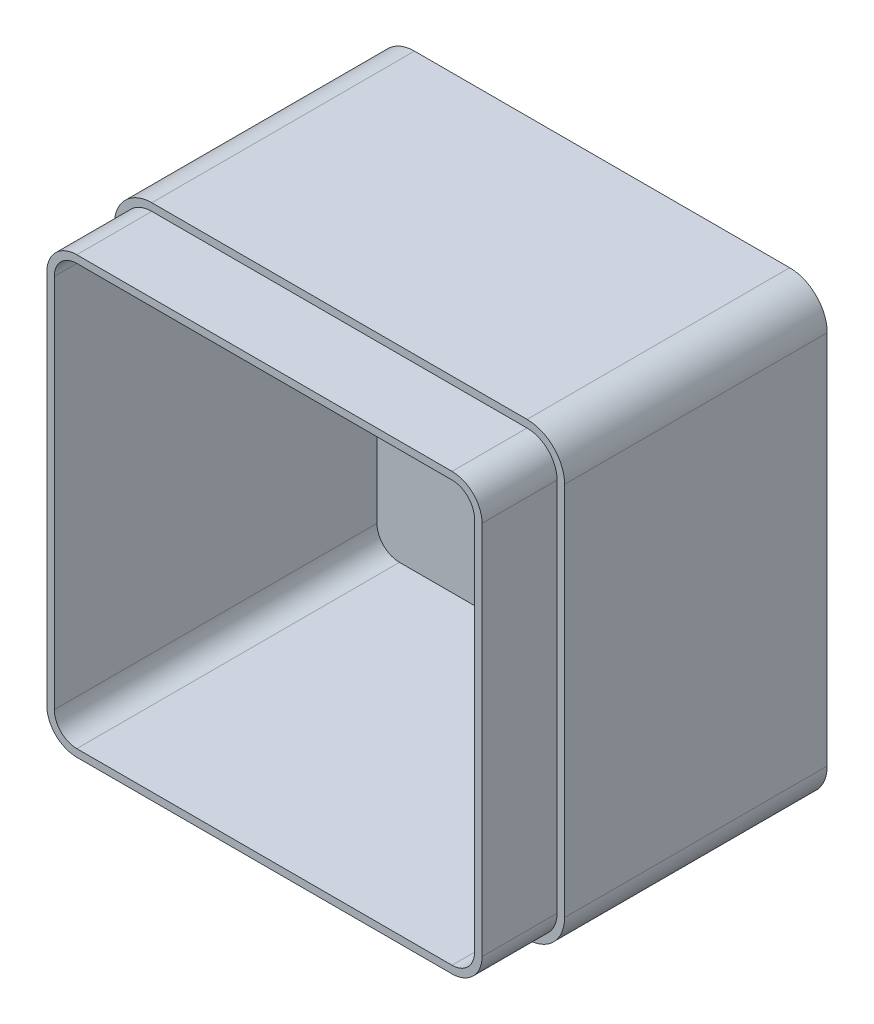
ISO-10303-21;
HEADER;
FILE_DESCRIPTION(('STEP AP214'),'2;1');
FILE_NAME('part.step','',(''),(''),'','','');
FILE_SCHEMA(('AUTOMOTIVE_DESIGN { 1 0 10303 214 1 1 1 1 }'));
ENDSEC;
DATA;
#1=APPLICATION_CONTEXT('core data for automotive mechanical design processes');
#2=APPLICATION_PROTOCOL_DEFINITION('international standard','automotive_design',2000,#1);
#3=PRODUCT_CONTEXT('',#1,'mechanical');
#4=PRODUCT('Part','Part','',(#3));
#5=PRODUCT_RELATED_PRODUCT_CATEGORY('part','',(#4));
#6=PRODUCT_DEFINITION_FORMATION('','',#4);
#7=PRODUCT_DEFINITION_CONTEXT('part definition',#1,'design');
#8=PRODUCT_DEFINITION('design','',#6,#7);
#9=PRODUCT_DEFINITION_SHAPE('','',#8);
#10=(LENGTH_UNIT() NAMED_UNIT(*) SI_UNIT(.MILLI.,.METRE.));
#11=(NAMED_UNIT(*) PLANE_ANGLE_UNIT() SI_UNIT($,.RADIAN.));
#12=(NAMED_UNIT(*) SI_UNIT($,.STERADIAN.) SOLID_ANGLE_UNIT());
#13=UNCERTAINTY_MEASURE_WITH_UNIT(LENGTH_MEASURE(1.E-05),#10,'distance_accuracy_value','');
#14=(GEOMETRIC_REPRESENTATION_CONTEXT(3) GLOBAL_UNCERTAINTY_ASSIGNED_CONTEXT((#13)) GLOBAL_UNIT_ASSIGNED_CONTEXT((#10,
#11,#12)) REPRESENTATION_CONTEXT('',''));
#15=CARTESIAN_POINT('',(0.,0.,0.));
#16=DIRECTION('',(0.,0.,1.));
#17=DIRECTION('',(1.,0.,0.));
#18=AXIS2_PLACEMENT_3D('',#15,#16,#17);
#19=CARTESIAN_POINT('',(0.,0.,90.));
#20=DIRECTION('',(0.,0.,1.));
#21=DIRECTION('',(1.,0.,0.));
#22=AXIS2_PLACEMENT_3D('',#19,#20,#21);
#23=PLANE('',#22);
#24=DIRECTION('',(1.,0.,0.));
#25=VECTOR('',#24,1.);
#26=CARTESIAN_POINT('',(-60.,-56.,90.));
#27=LINE('',#26,#25);
#28=CARTESIAN_POINT('',(-50.,-56.,90.));
#29=VERTEX_POINT('',#28);
#30=CARTESIAN_POINT('',(50.,-56.,90.));
#31=VERTEX_POINT('',#30);
#32=EDGE_CURVE('E291',#29,#31,#27,.T.);
#33=ORIENTED_EDGE('',*,*,#32,.F.);
#34=CARTESIAN_POINT('',(-50.,-50.,90.));
#35=DIRECTION('',(0.,0.,1.));
#36=DIRECTION('',(1.,0.,0.));
#37=AXIS2_PLACEMENT_3D('',#34,#35,#36);
#38=CIRCLE('',#37,6.);
#39=CARTESIAN_POINT('',(-56.,-50.,90.));
#40=VERTEX_POINT('',#39);
#41=EDGE_CURVE('E332',#40,#29,#38,.T.);
#42=ORIENTED_EDGE('',*,*,#41,.F.);
#43=DIRECTION('',(0.,-1.,0.));
#44=VECTOR('',#43,1.);
#45=CARTESIAN_POINT('',(-56.,60.,90.));
#46=LINE('',#45,#44);
#47=CARTESIAN_POINT('',(-56.,50.,90.));
#48=VERTEX_POINT('',#47);
#49=EDGE_CURVE('E335',#48,#40,#46,.T.);
#50=ORIENTED_EDGE('',*,*,#49,.F.);
#51=CARTESIAN_POINT('',(-50.,50.,90.));
#52=DIRECTION('',(0.,0.,1.));
#53=DIRECTION('',(1.,0.,0.));
#54=AXIS2_PLACEMENT_3D('',#51,#52,#53);
#55=CIRCLE('',#54,6.);
#56=CARTESIAN_POINT('',(-50.,56.,90.));
#57=VERTEX_POINT('',#56);
#58=EDGE_CURVE('E326',#57,#48,#55,.T.);
#59=ORIENTED_EDGE('',*,*,#58,.F.);
#60=DIRECTION('',(-1.,0.,0.));
#61=VECTOR('',#60,1.);
#62=CARTESIAN_POINT('',(-60.,56.,90.));
#63=LINE('',#62,#61);
#64=CARTESIAN_POINT('',(50.,56.,90.));
#65=VERTEX_POINT('',#64);
#66=EDGE_CURVE('E329',#65,#57,#63,.T.);
#67=ORIENTED_EDGE('',*,*,#66,.F.);
#68=CARTESIAN_POINT('',(50.,50.,90.));
#69=DIRECTION('',(0.,0.,1.));
#70=DIRECTION('',(1.,0.,0.));
#71=AXIS2_PLACEMENT_3D('',#68,#69,#70);
#72=CIRCLE('',#71,6.);
#73=CARTESIAN_POINT('',(56.,50.,90.));
#74=VERTEX_POINT('',#73);
#75=EDGE_CURVE('E330',#74,#65,#72,.T.);
#76=ORIENTED_EDGE('',*,*,#75,.F.);
#77=DIRECTION('',(0.,1.,0.));
#78=VECTOR('',#77,1.);
#79=CARTESIAN_POINT('',(56.,60.,90.));
#80=LINE('',#79,#78);
#81=CARTESIAN_POINT('',(56.,-50.,90.));
#82=VERTEX_POINT('',#81);
#83=EDGE_CURVE('E299',#82,#74,#80,.T.);
#84=ORIENTED_EDGE('',*,*,#83,.F.);
#85=CARTESIAN_POINT('',(50.,-50.,90.));
#86=DIRECTION('',(0.,0.,1.));
#87=DIRECTION('',(1.,0.,0.));
#88=AXIS2_PLACEMENT_3D('',#85,#86,#87);
#89=CIRCLE('',#88,6.);
#90=EDGE_CURVE('E319',#31,#82,#89,.T.);
#91=ORIENTED_EDGE('',*,*,#90,.F.);
#92=EDGE_LOOP('',(#33,#42,#50,#59,#67,#76,#84,#91));
#93=FACE_BOUND('',#92,.T.);
#94=DIRECTION('',(0.,-1.,0.));
#95=VECTOR('',#94,1.);
#96=CARTESIAN_POINT('',(-58.,50.,90.));
#97=LINE('',#96,#95);
#98=CARTESIAN_POINT('',(-58.,50.,90.));
#99=VERTEX_POINT('',#98);
#100=CARTESIAN_POINT('',(-58.,-50.,90.));
#101=VERTEX_POINT('',#100);
#102=EDGE_CURVE('E219',#99,#101,#97,.T.);
#103=ORIENTED_EDGE('',*,*,#102,.T.);
#104=CARTESIAN_POINT('',(-50.,-50.,90.));
#105=DIRECTION('',(0.,0.,1.));
#106=DIRECTION('',(1.,0.,0.));
#107=AXIS2_PLACEMENT_3D('',#104,#105,#106);
#108=CIRCLE('',#107,8.);
#109=CARTESIAN_POINT('',(-50.,-58.,90.));
#110=VERTEX_POINT('',#109);
#111=EDGE_CURVE('E239',#101,#110,#108,.T.);
#112=ORIENTED_EDGE('',*,*,#111,.T.);
#113=DIRECTION('',(1.,0.,0.));
#114=VECTOR('',#113,1.);
#115=CARTESIAN_POINT('',(-50.,-58.,90.));
#116=LINE('',#115,#114);
#117=CARTESIAN_POINT('',(50.,-58.,90.));
#118=VERTEX_POINT('',#117);
#119=EDGE_CURVE('E199',#110,#118,#116,.T.);
#120=ORIENTED_EDGE('',*,*,#119,.T.);
#121=CARTESIAN_POINT('',(50.,-50.,90.));
#122=DIRECTION('',(0.,0.,1.));
#123=DIRECTION('',(1.,0.,0.));
#124=AXIS2_PLACEMENT_3D('',#121,#122,#123);
#125=CIRCLE('',#124,8.);
#126=CARTESIAN_POINT('',(58.,-50.,90.));
#127=VERTEX_POINT('',#126);
#128=EDGE_CURVE('E48',#118,#127,#125,.T.);
#129=ORIENTED_EDGE('',*,*,#128,.T.);
#130=DIRECTION('',(0.,1.,0.));
#131=VECTOR('',#130,1.);
#132=CARTESIAN_POINT('',(58.,-50.,90.));
#133=LINE('',#132,#131);
#134=CARTESIAN_POINT('',(58.,50.,90.));
#135=VERTEX_POINT('',#134);
#136=EDGE_CURVE('E243',#127,#135,#133,.T.);
#137=ORIENTED_EDGE('',*,*,#136,.T.);
#138=CARTESIAN_POINT('',(50.,50.,90.));
#139=DIRECTION('',(0.,0.,1.));
#140=DIRECTION('',(1.,0.,0.));
#141=AXIS2_PLACEMENT_3D('',#138,#139,#140);
#142=CIRCLE('',#141,8.);
#143=CARTESIAN_POINT('',(50.,58.,90.));
#144=VERTEX_POINT('',#143);
#145=EDGE_CURVE('E246',#135,#144,#142,.T.);
#146=ORIENTED_EDGE('',*,*,#145,.T.);
#147=DIRECTION('',(-1.,0.,0.));
#148=VECTOR('',#147,1.);
#149=CARTESIAN_POINT('',(50.,58.,90.));
#150=LINE('',#149,#148);
#151=CARTESIAN_POINT('',(-50.,58.,90.));
#152=VERTEX_POINT('',#151);
#153=EDGE_CURVE('E249',#144,#152,#150,.T.);
#154=ORIENTED_EDGE('',*,*,#153,.T.);
#155=CARTESIAN_POINT('',(-50.,50.,90.));
#156=DIRECTION('',(0.,0.,1.));
#157=DIRECTION('',(1.,0.,0.));
#158=AXIS2_PLACEMENT_3D('',#155,#156,#157);
#159=CIRCLE('',#158,7.99999999999999);
#160=EDGE_CURVE('E222',#152,#99,#159,.T.);
#161=ORIENTED_EDGE('',*,*,#160,.T.);
#162=EDGE_LOOP('',(#103,#112,#120,#129,#137,#146,#154,#161));
#163=FACE_BOUND('',#162,.T.);
#164=ADVANCED_FACE('F33',(#93,#163),#23,.T.);
#165=CARTESIAN_POINT('',(56.,60.,90.));
#166=DIRECTION('',(-1.,0.,0.));
#167=DIRECTION('',(0.,-1.,0.));
#168=AXIS2_PLACEMENT_3D('',#165,#166,#167);
#169=PLANE('',#168);
#170=ORIENTED_EDGE('',*,*,#83,.T.);
#171=DIRECTION('',(0.,0.,1.));
#172=VECTOR('',#171,1.);
#173=CARTESIAN_POINT('',(56.,50.,90.));
#174=LINE('',#173,#172);
#175=CARTESIAN_POINT('',(56.,50.,4.));
#176=VERTEX_POINT('',#175);
#177=EDGE_CURVE('E286',#176,#74,#174,.T.);
#178=ORIENTED_EDGE('',*,*,#177,.F.);
#179=DIRECTION('',(0.,1.,0.));
#180=VECTOR('',#179,1.);
#181=CARTESIAN_POINT('',(56.,60.,4.));
#182=LINE('',#181,#180);
#183=CARTESIAN_POINT('',(56.,-50.,4.));
#184=VERTEX_POINT('',#183);
#185=EDGE_CURVE('E281',#184,#176,#182,.T.);
#186=ORIENTED_EDGE('',*,*,#185,.F.);
#187=DIRECTION('',(0.,0.,1.));
#188=VECTOR('',#187,1.);
#189=CARTESIAN_POINT('',(56.,-50.,90.));
#190=LINE('',#189,#188);
#191=EDGE_CURVE('E282',#82,#184,#190,.F.);
#192=ORIENTED_EDGE('',*,*,#191,.F.);
#193=EDGE_LOOP('',(#170,#178,#186,#192));
#194=FACE_BOUND('',#193,.T.);
#195=ADVANCED_FACE('F428',(#194),#169,.T.);
#196=CARTESIAN_POINT('',(-60.,56.,90.));
#197=DIRECTION('',(0.,-1.,0.));
#198=DIRECTION('',(0.,0.,-1.));
#199=AXIS2_PLACEMENT_3D('',#196,#197,#198);
#200=PLANE('',#199);
#201=ORIENTED_EDGE('',*,*,#66,.T.);
#202=DIRECTION('',(0.,0.,-1.));
#203=VECTOR('',#202,1.);
#204=CARTESIAN_POINT('',(-50.,56.,90.));
#205=LINE('',#204,#203);
#206=CARTESIAN_POINT('',(-50.,56.,4.));
#207=VERTEX_POINT('',#206);
#208=EDGE_CURVE('E313',#207,#57,#205,.F.);
#209=ORIENTED_EDGE('',*,*,#208,.F.);
#210=DIRECTION('',(-1.,0.,0.));
#211=VECTOR('',#210,1.);
#212=CARTESIAN_POINT('',(-60.,56.,4.));
#213=LINE('',#212,#211);
#214=CARTESIAN_POINT('',(50.,56.,4.));
#215=VERTEX_POINT('',#214);
#216=EDGE_CURVE('E289',#215,#207,#213,.T.);
#217=ORIENTED_EDGE('',*,*,#216,.F.);
#218=DIRECTION('',(0.,0.,-1.));
#219=VECTOR('',#218,1.);
#220=CARTESIAN_POINT('',(50.,56.,90.));
#221=LINE('',#220,#219);
#222=EDGE_CURVE('E309',#65,#215,#221,.T.);
#223=ORIENTED_EDGE('',*,*,#222,.F.);
#224=EDGE_LOOP('',(#201,#209,#217,#223));
#225=FACE_BOUND('',#224,.T.);
#226=ADVANCED_FACE('F434',(#225),#200,.T.);
#227=CARTESIAN_POINT('',(-56.,60.,90.));
#228=DIRECTION('',(1.,0.,0.));
#229=DIRECTION('',(0.,1.,0.));
#230=AXIS2_PLACEMENT_3D('',#227,#228,#229);
#231=PLANE('',#230);
#232=DIRECTION('',(0.,-1.,0.));
#233=VECTOR('',#232,1.);
#234=CARTESIAN_POINT('',(-56.,60.,4.));
#235=LINE('',#234,#233);
#236=CARTESIAN_POINT('',(-56.,50.,4.));
#237=VERTEX_POINT('',#236);
#238=CARTESIAN_POINT('',(-56.,-50.,4.));
#239=VERTEX_POINT('',#238);
#240=EDGE_CURVE('E300',#237,#239,#235,.T.);
#241=ORIENTED_EDGE('',*,*,#240,.F.);
#242=DIRECTION('',(0.,0.,1.));
#243=VECTOR('',#242,1.);
#244=CARTESIAN_POINT('',(-56.,50.,90.));
#245=LINE('',#244,#243);
#246=EDGE_CURVE('E316',#48,#237,#245,.F.);
#247=ORIENTED_EDGE('',*,*,#246,.F.);
#248=ORIENTED_EDGE('',*,*,#49,.T.);
#249=DIRECTION('',(0.,0.,1.));
#250=VECTOR('',#249,1.);
#251=CARTESIAN_POINT('',(-56.,-50.,90.));
#252=LINE('',#251,#250);
#253=EDGE_CURVE('E315',#239,#40,#252,.T.);
#254=ORIENTED_EDGE('',*,*,#253,.F.);
#255=EDGE_LOOP('',(#241,#247,#248,#254));
#256=FACE_BOUND('',#255,.T.);
#257=ADVANCED_FACE('F463',(#256),#231,.T.);
#258=CARTESIAN_POINT('',(-60.,-56.,90.));
#259=DIRECTION('',(0.,1.,0.));
#260=DIRECTION('',(0.,0.,1.));
#261=AXIS2_PLACEMENT_3D('',#258,#259,#260);
#262=PLANE('',#261);
#263=DIRECTION('',(1.,0.,0.));
#264=VECTOR('',#263,1.);
#265=CARTESIAN_POINT('',(-60.,-56.,4.));
#266=LINE('',#265,#264);
#267=CARTESIAN_POINT('',(-50.,-56.,4.));
#268=VERTEX_POINT('',#267);
#269=CARTESIAN_POINT('',(50.,-56.,4.));
#270=VERTEX_POINT('',#269);
#271=EDGE_CURVE('E296',#268,#270,#266,.T.);
#272=ORIENTED_EDGE('',*,*,#271,.F.);
#273=DIRECTION('',(0.,0.,1.));
#274=VECTOR('',#273,1.);
#275=CARTESIAN_POINT('',(-50.,-56.,90.));
#276=LINE('',#275,#274);
#277=EDGE_CURVE('E294',#29,#268,#276,.F.);
#278=ORIENTED_EDGE('',*,*,#277,.F.);
#279=ORIENTED_EDGE('',*,*,#32,.T.);
#280=DIRECTION('',(0.,0.,1.));
#281=VECTOR('',#280,1.);
#282=CARTESIAN_POINT('',(50.,-56.,90.));
#283=LINE('',#282,#281);
#284=EDGE_CURVE('E324',#270,#31,#283,.T.);
#285=ORIENTED_EDGE('',*,*,#284,.F.);
#286=EDGE_LOOP('',(#272,#278,#279,#285));
#287=FACE_BOUND('',#286,.T.);
#288=ADVANCED_FACE('F459',(#287),#262,.T.);
#289=CARTESIAN_POINT('',(0.,0.,4.));
#290=DIRECTION('',(0.,0.,1.));
#291=DIRECTION('',(1.,0.,0.));
#292=AXIS2_PLACEMENT_3D('',#289,#290,#291);
#293=PLANE('',#292);
#294=ORIENTED_EDGE('',*,*,#185,.T.);
#295=CARTESIAN_POINT('',(50.,50.,4.));
#296=DIRECTION('',(0.,0.,1.));
#297=DIRECTION('',(1.,0.,0.));
#298=AXIS2_PLACEMENT_3D('',#295,#296,#297);
#299=CIRCLE('',#298,6.);
#300=EDGE_CURVE('E302',#215,#176,#299,.F.);
#301=ORIENTED_EDGE('',*,*,#300,.F.);
#302=ORIENTED_EDGE('',*,*,#216,.T.);
#303=CARTESIAN_POINT('',(-50.,50.,4.));
#304=DIRECTION('',(0.,0.,1.));
#305=DIRECTION('',(1.,0.,0.));
#306=AXIS2_PLACEMENT_3D('',#303,#304,#305);
#307=CIRCLE('',#306,6.);
#308=EDGE_CURVE('E285',#237,#207,#307,.F.);
#309=ORIENTED_EDGE('',*,*,#308,.F.);
#310=ORIENTED_EDGE('',*,*,#240,.T.);
#311=CARTESIAN_POINT('',(-50.,-50.,4.));
#312=DIRECTION('',(0.,0.,1.));
#313=DIRECTION('',(1.,0.,0.));
#314=AXIS2_PLACEMENT_3D('',#311,#312,#313);
#315=CIRCLE('',#314,6.);
#316=EDGE_CURVE('E295',#268,#239,#315,.F.);
#317=ORIENTED_EDGE('',*,*,#316,.F.);
#318=ORIENTED_EDGE('',*,*,#271,.T.);
#319=CARTESIAN_POINT('',(50.,-50.,4.));
#320=DIRECTION('',(0.,0.,1.));
#321=DIRECTION('',(1.,0.,0.));
#322=AXIS2_PLACEMENT_3D('',#319,#320,#321);
#323=CIRCLE('',#322,6.);
#324=EDGE_CURVE('E292',#184,#270,#323,.F.);
#325=ORIENTED_EDGE('',*,*,#324,.F.);
#326=EDGE_LOOP('',(#294,#301,#302,#309,#310,#317,#318,#325));
#327=FACE_BOUND('',#326,.T.);
#328=ADVANCED_FACE('F455',(#327),#293,.T.);
#329=CARTESIAN_POINT('',(50.,-50.,90.));
#330=DIRECTION('',(0.,0.,-1.));
#331=DIRECTION('',(-1.,0.,0.));
#332=AXIS2_PLACEMENT_3D('',#329,#330,#331);
#333=CYLINDRICAL_SURFACE('',#332,6.);
#334=ORIENTED_EDGE('',*,*,#90,.T.);
#335=ORIENTED_EDGE('',*,*,#191,.T.);
#336=ORIENTED_EDGE('',*,*,#324,.T.);
#337=ORIENTED_EDGE('',*,*,#284,.T.);
#338=EDGE_LOOP('',(#334,#335,#336,#337));
#339=FACE_BOUND('',#338,.T.);
#340=ADVANCED_FACE('F451',(#339),#333,.F.);
#341=CARTESIAN_POINT('',(-50.,-50.,90.));
#342=DIRECTION('',(0.,0.,-1.));
#343=DIRECTION('',(-1.,0.,0.));
#344=AXIS2_PLACEMENT_3D('',#341,#342,#343);
#345=CYLINDRICAL_SURFACE('',#344,6.);
#346=ORIENTED_EDGE('',*,*,#41,.T.);
#347=ORIENTED_EDGE('',*,*,#277,.T.);
#348=ORIENTED_EDGE('',*,*,#316,.T.);
#349=ORIENTED_EDGE('',*,*,#253,.T.);
#350=EDGE_LOOP('',(#346,#347,#348,#349));
#351=FACE_BOUND('',#350,.T.);
#352=ADVANCED_FACE('F447',(#351),#345,.F.);
#353=CARTESIAN_POINT('',(50.,50.,90.));
#354=DIRECTION('',(0.,0.,-1.));
#355=DIRECTION('',(-1.,0.,0.));
#356=AXIS2_PLACEMENT_3D('',#353,#354,#355);
#357=CYLINDRICAL_SURFACE('',#356,6.);
#358=ORIENTED_EDGE('',*,*,#75,.T.);
#359=ORIENTED_EDGE('',*,*,#222,.T.);
#360=ORIENTED_EDGE('',*,*,#300,.T.);
#361=ORIENTED_EDGE('',*,*,#177,.T.);
#362=EDGE_LOOP('',(#358,#359,#360,#361));
#363=FACE_BOUND('',#362,.T.);
#364=ADVANCED_FACE('F443',(#363),#357,.F.);
#365=CARTESIAN_POINT('',(-50.,50.,90.));
#366=DIRECTION('',(0.,0.,-1.));
#367=DIRECTION('',(-1.,0.,0.));
#368=AXIS2_PLACEMENT_3D('',#365,#366,#367);
#369=CYLINDRICAL_SURFACE('',#368,6.);
#370=ORIENTED_EDGE('',*,*,#58,.T.);
#371=ORIENTED_EDGE('',*,*,#246,.T.);
#372=ORIENTED_EDGE('',*,*,#308,.T.);
#373=ORIENTED_EDGE('',*,*,#208,.T.);
#374=EDGE_LOOP('',(#370,#371,#372,#373));
#375=FACE_BOUND('',#374,.T.);
#376=ADVANCED_FACE('F440',(#375),#369,.F.);
#377=CARTESIAN_POINT('',(-50.,-50.,70.));
#378=DIRECTION('',(0.,0.,1.));
#379=DIRECTION('',(1.,0.,0.));
#380=AXIS2_PLACEMENT_3D('',#377,#378,#379);
#381=PLANE('',#380);
#382=DIRECTION('',(0.,-1.,0.));
#383=VECTOR('',#382,1.);
#384=CARTESIAN_POINT('',(-58.,50.,70.));
#385=LINE('',#384,#383);
#386=CARTESIAN_POINT('',(-58.,50.,70.));
#387=VERTEX_POINT('',#386);
#388=CARTESIAN_POINT('',(-58.,-50.,70.));
#389=VERTEX_POINT('',#388);
#390=EDGE_CURVE('E205',#387,#389,#385,.T.);
#391=ORIENTED_EDGE('',*,*,#390,.F.);
#392=CARTESIAN_POINT('',(-50.,50.,70.));
#393=DIRECTION('',(0.,0.,1.));
#394=DIRECTION('',(1.,0.,0.));
#395=AXIS2_PLACEMENT_3D('',#392,#393,#394);
#396=CIRCLE('',#395,7.99999999999999);
#397=CARTESIAN_POINT('',(-50.,58.,70.));
#398=VERTEX_POINT('',#397);
#399=EDGE_CURVE('E235',#398,#387,#396,.T.);
#400=ORIENTED_EDGE('',*,*,#399,.F.);
#401=DIRECTION('',(-1.,0.,0.));
#402=VECTOR('',#401,1.);
#403=CARTESIAN_POINT('',(50.,58.,70.));
#404=LINE('',#403,#402);
#405=CARTESIAN_POINT('',(50.,58.,70.));
#406=VERTEX_POINT('',#405);
#407=EDGE_CURVE('E232',#406,#398,#404,.T.);
#408=ORIENTED_EDGE('',*,*,#407,.F.);
#409=CARTESIAN_POINT('',(50.,50.,70.));
#410=DIRECTION('',(0.,0.,1.));
#411=DIRECTION('',(1.,0.,0.));
#412=AXIS2_PLACEMENT_3D('',#409,#410,#411);
#413=CIRCLE('',#412,8.);
#414=CARTESIAN_POINT('',(58.,50.,70.));
#415=VERTEX_POINT('',#414);
#416=EDGE_CURVE('E229',#415,#406,#413,.T.);
#417=ORIENTED_EDGE('',*,*,#416,.F.);
#418=DIRECTION('',(0.,1.,0.));
#419=VECTOR('',#418,1.);
#420=CARTESIAN_POINT('',(58.,-50.,70.));
#421=LINE('',#420,#419);
#422=CARTESIAN_POINT('',(58.,-50.,70.));
#423=VERTEX_POINT('',#422);
#424=EDGE_CURVE('E226',#423,#415,#421,.T.);
#425=ORIENTED_EDGE('',*,*,#424,.F.);
#426=CARTESIAN_POINT('',(50.,-50.,70.));
#427=DIRECTION('',(0.,0.,1.));
#428=DIRECTION('',(1.,0.,0.));
#429=AXIS2_PLACEMENT_3D('',#426,#427,#428);
#430=CIRCLE('',#429,8.);
#431=CARTESIAN_POINT('',(50.,-58.,70.));
#432=VERTEX_POINT('',#431);
#433=EDGE_CURVE('E215',#432,#423,#430,.T.);
#434=ORIENTED_EDGE('',*,*,#433,.F.);
#435=DIRECTION('',(1.,0.,0.));
#436=VECTOR('',#435,1.);
#437=CARTESIAN_POINT('',(-50.,-58.,70.));
#438=LINE('',#437,#436);
#439=CARTESIAN_POINT('',(-50.,-58.,70.));
#440=VERTEX_POINT('',#439);
#441=EDGE_CURVE('E197',#440,#432,#438,.T.);
#442=ORIENTED_EDGE('',*,*,#441,.F.);
#443=CARTESIAN_POINT('',(-50.,-50.,70.));
#444=DIRECTION('',(0.,0.,1.));
#445=DIRECTION('',(1.,0.,0.));
#446=AXIS2_PLACEMENT_3D('',#443,#444,#445);
#447=CIRCLE('',#446,8.);
#448=EDGE_CURVE('E211',#389,#440,#447,.T.);
#449=ORIENTED_EDGE('',*,*,#448,.F.);
#450=EDGE_LOOP('',(#391,#400,#408,#417,#425,#434,#442,#449));
#451=FACE_BOUND('',#450,.T.);
#452=CARTESIAN_POINT('',(-50.,-50.,70.));
#453=DIRECTION('',(0.,0.,1.));
#454=DIRECTION('',(1.,0.,0.));
#455=AXIS2_PLACEMENT_3D('',#452,#453,#454);
#456=CIRCLE('',#455,10.);
#457=CARTESIAN_POINT('',(-60.,-50.,70.));
#458=VERTEX_POINT('',#457);
#459=CARTESIAN_POINT('',(-50.,-60.,70.));
#460=VERTEX_POINT('',#459);
#461=EDGE_CURVE('E255',#458,#460,#456,.T.);
#462=ORIENTED_EDGE('',*,*,#461,.T.);
#463=DIRECTION('',(1.,0.,0.));
#464=VECTOR('',#463,1.);
#465=CARTESIAN_POINT('',(-50.,-60.,70.));
#466=LINE('',#465,#464);
#467=CARTESIAN_POINT('',(50.,-60.,70.));
#468=VERTEX_POINT('',#467);
#469=EDGE_CURVE('E268',#460,#468,#466,.T.);
#470=ORIENTED_EDGE('',*,*,#469,.T.);
#471=CARTESIAN_POINT('',(50.,-50.,70.));
#472=DIRECTION('',(0.,0.,1.));
#473=DIRECTION('',(1.,0.,0.));
#474=AXIS2_PLACEMENT_3D('',#471,#472,#473);
#475=CIRCLE('',#474,10.);
#476=CARTESIAN_POINT('',(60.,-50.,70.));
#477=VERTEX_POINT('',#476);
#478=EDGE_CURVE('E270',#468,#477,#475,.T.);
#479=ORIENTED_EDGE('',*,*,#478,.T.);
#480=DIRECTION('',(0.,1.,0.));
#481=VECTOR('',#480,1.);
#482=CARTESIAN_POINT('',(60.,-50.,70.));
#483=LINE('',#482,#481);
#484=CARTESIAN_POINT('',(60.,50.,70.));
#485=VERTEX_POINT('',#484);
#486=EDGE_CURVE('E272',#477,#485,#483,.T.);
#487=ORIENTED_EDGE('',*,*,#486,.T.);
#488=CARTESIAN_POINT('',(50.,50.,70.));
#489=DIRECTION('',(0.,0.,1.));
#490=DIRECTION('',(1.,0.,0.));
#491=AXIS2_PLACEMENT_3D('',#488,#489,#490);
#492=CIRCLE('',#491,9.99999999999999);
#493=CARTESIAN_POINT('',(50.,60.,70.));
#494=VERTEX_POINT('',#493);
#495=EDGE_CURVE('E274',#485,#494,#492,.T.);
#496=ORIENTED_EDGE('',*,*,#495,.T.);
#497=DIRECTION('',(-1.,0.,0.));
#498=VECTOR('',#497,1.);
#499=CARTESIAN_POINT('',(50.,60.,70.));
#500=LINE('',#499,#498);
#501=CARTESIAN_POINT('',(-50.,60.,70.));
#502=VERTEX_POINT('',#501);
#503=EDGE_CURVE('E56',#494,#502,#500,.T.);
#504=ORIENTED_EDGE('',*,*,#503,.T.);
#505=CARTESIAN_POINT('',(-50.,50.,70.));
#506=DIRECTION('',(0.,0.,1.));
#507=DIRECTION('',(1.,0.,0.));
#508=AXIS2_PLACEMENT_3D('',#505,#506,#507);
#509=CIRCLE('',#508,9.99999999999999);
#510=CARTESIAN_POINT('',(-60.,50.,70.));
#511=VERTEX_POINT('',#510);
#512=EDGE_CURVE('E277',#502,#511,#509,.T.);
#513=ORIENTED_EDGE('',*,*,#512,.T.);
#514=DIRECTION('',(0.,-1.,0.));
#515=VECTOR('',#514,1.);
#516=CARTESIAN_POINT('',(-60.,50.,70.));
#517=LINE('',#516,#515);
#518=EDGE_CURVE('E279',#511,#458,#517,.T.);
#519=ORIENTED_EDGE('',*,*,#518,.T.);
#520=EDGE_LOOP('',(#462,#470,#479,#487,#496,#504,#513,#519));
#521=FACE_BOUND('',#520,.T.);
#522=ADVANCED_FACE('F210',(#451,#521),#381,.T.);
#523=CARTESIAN_POINT('',(-50.,-50.,70.));
#524=DIRECTION('',(0.,0.,1.));
#525=DIRECTION('',(1.,0.,0.));
#526=AXIS2_PLACEMENT_3D('',#523,#524,#525);
#527=CYLINDRICAL_SURFACE('',#526,8.);
#528=ORIENTED_EDGE('',*,*,#111,.F.);
#529=DIRECTION('',(0.,0.,1.));
#530=VECTOR('',#529,1.);
#531=CARTESIAN_POINT('',(-58.,-50.,70.));
#532=LINE('',#531,#530);
#533=EDGE_CURVE('E218',#389,#101,#532,.T.);
#534=ORIENTED_EDGE('',*,*,#533,.F.);
#535=ORIENTED_EDGE('',*,*,#448,.T.);
#536=DIRECTION('',(0.,0.,1.));
#537=VECTOR('',#536,1.);
#538=CARTESIAN_POINT('',(-50.,-58.,70.));
#539=LINE('',#538,#537);
#540=EDGE_CURVE('E194',#440,#110,#539,.T.);
#541=ORIENTED_EDGE('',*,*,#540,.T.);
#542=EDGE_LOOP('',(#528,#534,#535,#541));
#543=FACE_BOUND('',#542,.T.);
#544=ADVANCED_FACE('F217',(#543),#527,.T.);
#545=CARTESIAN_POINT('',(-58.,50.,70.));
#546=DIRECTION('',(-1.,0.,0.));
#547=DIRECTION('',(0.,0.,1.));
#548=AXIS2_PLACEMENT_3D('',#545,#546,#547);
#549=PLANE('',#548);
#550=ORIENTED_EDGE('',*,*,#102,.F.);
#551=DIRECTION('',(0.,0.,1.));
#552=VECTOR('',#551,1.);
#553=CARTESIAN_POINT('',(-58.,50.,70.));
#554=LINE('',#553,#552);
#555=EDGE_CURVE('E256',#387,#99,#554,.T.);
#556=ORIENTED_EDGE('',*,*,#555,.F.);
#557=ORIENTED_EDGE('',*,*,#390,.T.);
#558=ORIENTED_EDGE('',*,*,#533,.T.);
#559=EDGE_LOOP('',(#550,#556,#557,#558));
#560=FACE_BOUND('',#559,.T.);
#561=ADVANCED_FACE('F474',(#560),#549,.T.);
#562=CARTESIAN_POINT('',(-50.,50.,70.));
#563=DIRECTION('',(0.,0.,1.));
#564=DIRECTION('',(1.,0.,0.));
#565=AXIS2_PLACEMENT_3D('',#562,#563,#564);
#566=CYLINDRICAL_SURFACE('',#565,7.99999999999999);
#567=ORIENTED_EDGE('',*,*,#160,.F.);
#568=DIRECTION('',(0.,0.,1.));
#569=VECTOR('',#568,1.);
#570=CARTESIAN_POINT('',(-50.,58.,70.));
#571=LINE('',#570,#569);
#572=EDGE_CURVE('E258',#398,#152,#571,.T.);
#573=ORIENTED_EDGE('',*,*,#572,.F.);
#574=ORIENTED_EDGE('',*,*,#399,.T.);
#575=ORIENTED_EDGE('',*,*,#555,.T.);
#576=EDGE_LOOP('',(#567,#573,#574,#575));
#577=FACE_BOUND('',#576,.T.);
#578=ADVANCED_FACE('F489',(#577),#566,.T.);
#579=CARTESIAN_POINT('',(50.,58.,70.));
#580=DIRECTION('',(0.,1.,0.));
#581=DIRECTION('',(0.,0.,1.));
#582=AXIS2_PLACEMENT_3D('',#579,#580,#581);
#583=PLANE('',#582);
#584=ORIENTED_EDGE('',*,*,#153,.F.);
#585=DIRECTION('',(0.,0.,1.));
#586=VECTOR('',#585,1.);
#587=CARTESIAN_POINT('',(50.,58.,70.));
#588=LINE('',#587,#586);
#589=EDGE_CURVE('E260',#406,#144,#588,.T.);
#590=ORIENTED_EDGE('',*,*,#589,.F.);
#591=ORIENTED_EDGE('',*,*,#407,.T.);
#592=ORIENTED_EDGE('',*,*,#572,.T.);
#593=EDGE_LOOP('',(#584,#590,#591,#592));
#594=FACE_BOUND('',#593,.T.);
#595=ADVANCED_FACE('F485',(#594),#583,.T.);
#596=CARTESIAN_POINT('',(50.,50.,70.));
#597=DIRECTION('',(0.,0.,1.));
#598=DIRECTION('',(1.,0.,0.));
#599=AXIS2_PLACEMENT_3D('',#596,#597,#598);
#600=CYLINDRICAL_SURFACE('',#599,8.);
#601=ORIENTED_EDGE('',*,*,#145,.F.);
#602=DIRECTION('',(0.,0.,1.));
#603=VECTOR('',#602,1.);
#604=CARTESIAN_POINT('',(58.,50.,70.));
#605=LINE('',#604,#603);
#606=EDGE_CURVE('E262',#415,#135,#605,.T.);
#607=ORIENTED_EDGE('',*,*,#606,.F.);
#608=ORIENTED_EDGE('',*,*,#416,.T.);
#609=ORIENTED_EDGE('',*,*,#589,.T.);
#610=EDGE_LOOP('',(#601,#607,#608,#609));
#611=FACE_BOUND('',#610,.T.);
#612=ADVANCED_FACE('F481',(#611),#600,.T.);
#613=CARTESIAN_POINT('',(58.,-50.,70.));
#614=DIRECTION('',(1.,0.,0.));
#615=DIRECTION('',(0.,1.,0.));
#616=AXIS2_PLACEMENT_3D('',#613,#614,#615);
#617=PLANE('',#616);
#618=ORIENTED_EDGE('',*,*,#136,.F.);
#619=DIRECTION('',(0.,0.,1.));
#620=VECTOR('',#619,1.);
#621=CARTESIAN_POINT('',(58.,-50.,70.));
#622=LINE('',#621,#620);
#623=EDGE_CURVE('E264',#423,#127,#622,.T.);
#624=ORIENTED_EDGE('',*,*,#623,.F.);
#625=ORIENTED_EDGE('',*,*,#424,.T.);
#626=ORIENTED_EDGE('',*,*,#606,.T.);
#627=EDGE_LOOP('',(#618,#624,#625,#626));
#628=FACE_BOUND('',#627,.T.);
#629=ADVANCED_FACE('F478',(#628),#617,.T.);
#630=CARTESIAN_POINT('',(50.,-50.,70.));
#631=DIRECTION('',(0.,0.,1.));
#632=DIRECTION('',(1.,0.,0.));
#633=AXIS2_PLACEMENT_3D('',#630,#631,#632);
#634=CYLINDRICAL_SURFACE('',#633,8.);
#635=ORIENTED_EDGE('',*,*,#128,.F.);
#636=DIRECTION('',(0.,0.,1.));
#637=VECTOR('',#636,1.);
#638=CARTESIAN_POINT('',(50.,-58.,70.));
#639=LINE('',#638,#637);
#640=EDGE_CURVE('E204',#432,#118,#639,.T.);
#641=ORIENTED_EDGE('',*,*,#640,.F.);
#642=ORIENTED_EDGE('',*,*,#433,.T.);
#643=ORIENTED_EDGE('',*,*,#623,.T.);
#644=EDGE_LOOP('',(#635,#641,#642,#643));
#645=FACE_BOUND('',#644,.T.);
#646=ADVANCED_FACE('F423',(#645),#634,.T.);
#647=CARTESIAN_POINT('',(-50.,-58.,70.));
#648=DIRECTION('',(0.,-1.,0.));
#649=DIRECTION('',(0.,0.,-1.));
#650=AXIS2_PLACEMENT_3D('',#647,#648,#649);
#651=PLANE('',#650);
#652=ORIENTED_EDGE('',*,*,#119,.F.);
#653=ORIENTED_EDGE('',*,*,#540,.F.);
#654=ORIENTED_EDGE('',*,*,#441,.T.);
#655=ORIENTED_EDGE('',*,*,#640,.T.);
#656=EDGE_LOOP('',(#652,#653,#654,#655));
#657=FACE_BOUND('',#656,.T.);
#658=ADVANCED_FACE('F196',(#657),#651,.T.);
#659=CARTESIAN_POINT('',(0.,0.,0.));
#660=DIRECTION('',(0.,0.,1.));
#661=DIRECTION('',(1.,0.,0.));
#662=AXIS2_PLACEMENT_3D('',#659,#660,#661);
#663=PLANE('',#662);
#664=DIRECTION('',(0.,1.,0.));
#665=VECTOR('',#664,1.);
#666=CARTESIAN_POINT('',(60.,60.,0.));
#667=LINE('',#666,#665);
#668=CARTESIAN_POINT('',(60.,-50.,0.));
#669=VERTEX_POINT('',#668);
#670=CARTESIAN_POINT('',(60.,50.,0.));
#671=VERTEX_POINT('',#670);
#672=EDGE_CURVE('E312',#669,#671,#667,.T.);
#673=ORIENTED_EDGE('',*,*,#672,.F.);
#674=CARTESIAN_POINT('',(50.,-50.,0.));
#675=DIRECTION('',(0.,0.,1.));
#676=DIRECTION('',(1.,0.,0.));
#677=AXIS2_PLACEMENT_3D('',#674,#675,#676);
#678=CIRCLE('',#677,10.);
#679=CARTESIAN_POINT('',(50.,-60.,0.));
#680=VERTEX_POINT('',#679);
#681=EDGE_CURVE('E364',#669,#680,#678,.F.);
#682=ORIENTED_EDGE('',*,*,#681,.T.);
#683=DIRECTION('',(1.,0.,0.));
#684=VECTOR('',#683,1.);
#685=CARTESIAN_POINT('',(-60.,-60.,0.));
#686=LINE('',#685,#684);
#687=CARTESIAN_POINT('',(-50.,-60.,0.));
#688=VERTEX_POINT('',#687);
#689=EDGE_CURVE('E350',#688,#680,#686,.T.);
#690=ORIENTED_EDGE('',*,*,#689,.F.);
#691=CARTESIAN_POINT('',(-50.,-50.,0.));
#692=DIRECTION('',(0.,0.,1.));
#693=DIRECTION('',(1.,0.,0.));
#694=AXIS2_PLACEMENT_3D('',#691,#692,#693);
#695=CIRCLE('',#694,10.);
#696=CARTESIAN_POINT('',(-60.,-50.,0.));
#697=VERTEX_POINT('',#696);
#698=EDGE_CURVE('E362',#688,#697,#695,.F.);
#699=ORIENTED_EDGE('',*,*,#698,.T.);
#700=DIRECTION('',(0.,-1.,0.));
#701=VECTOR('',#700,1.);
#702=CARTESIAN_POINT('',(-60.,60.,0.));
#703=LINE('',#702,#701);
#704=CARTESIAN_POINT('',(-60.,50.,0.));
#705=VERTEX_POINT('',#704);
#706=EDGE_CURVE('E347',#705,#697,#703,.T.);
#707=ORIENTED_EDGE('',*,*,#706,.F.);
#708=CARTESIAN_POINT('',(-50.,50.,0.));
#709=DIRECTION('',(0.,0.,1.));
#710=DIRECTION('',(1.,0.,0.));
#711=AXIS2_PLACEMENT_3D('',#708,#709,#710);
#712=CIRCLE('',#711,10.);
#713=CARTESIAN_POINT('',(-50.,60.,0.));
#714=VERTEX_POINT('',#713);
#715=EDGE_CURVE('E358',#705,#714,#712,.F.);
#716=ORIENTED_EDGE('',*,*,#715,.T.);
#717=DIRECTION('',(-1.,0.,0.));
#718=VECTOR('',#717,1.);
#719=CARTESIAN_POINT('',(-60.,60.,0.));
#720=LINE('',#719,#718);
#721=CARTESIAN_POINT('',(50.,60.,0.));
#722=VERTEX_POINT('',#721);
#723=EDGE_CURVE('E344',#722,#714,#720,.T.);
#724=ORIENTED_EDGE('',*,*,#723,.F.);
#725=CARTESIAN_POINT('',(50.,50.,0.));
#726=DIRECTION('',(0.,0.,1.));
#727=DIRECTION('',(1.,0.,0.));
#728=AXIS2_PLACEMENT_3D('',#725,#726,#727);
#729=CIRCLE('',#728,10.);
#730=EDGE_CURVE('E360',#722,#671,#729,.F.);
#731=ORIENTED_EDGE('',*,*,#730,.T.);
#732=EDGE_LOOP('',(#673,#682,#690,#699,#707,#716,#724,#731));
#733=FACE_BOUND('',#732,.T.);
#734=ADVANCED_FACE('F414',(#733),#663,.F.);
#735=CARTESIAN_POINT('',(50.,-50.,90.));
#736=DIRECTION('',(0.,0.,-1.));
#737=DIRECTION('',(-1.,0.,0.));
#738=AXIS2_PLACEMENT_3D('',#735,#736,#737);
#739=CYLINDRICAL_SURFACE('',#738,10.);
#740=DIRECTION('',(0.,0.,-1.));
#741=VECTOR('',#740,1.);
#742=CARTESIAN_POINT('',(60.,-50.,90.));
#743=LINE('',#742,#741);
#744=EDGE_CURVE('E356',#477,#669,#743,.T.);
#745=ORIENTED_EDGE('',*,*,#744,.F.);
#746=ORIENTED_EDGE('',*,*,#478,.F.);
#747=DIRECTION('',(0.,0.,-1.));
#748=VECTOR('',#747,1.);
#749=CARTESIAN_POINT('',(50.,-60.,90.));
#750=LINE('',#749,#748);
#751=EDGE_CURVE('E368',#680,#468,#750,.F.);
#752=ORIENTED_EDGE('',*,*,#751,.F.);
#753=ORIENTED_EDGE('',*,*,#681,.F.);
#754=EDGE_LOOP('',(#745,#746,#752,#753));
#755=FACE_BOUND('',#754,.T.);
#756=ADVANCED_FACE('F403',(#755),#739,.T.);
#757=CARTESIAN_POINT('',(-50.,-50.,90.));
#758=DIRECTION('',(0.,0.,-1.));
#759=DIRECTION('',(-1.,0.,0.));
#760=AXIS2_PLACEMENT_3D('',#757,#758,#759);
#761=CYLINDRICAL_SURFACE('',#760,10.);
#762=DIRECTION('',(0.,0.,-1.));
#763=VECTOR('',#762,1.);
#764=CARTESIAN_POINT('',(-50.,-60.,90.));
#765=LINE('',#764,#763);
#766=EDGE_CURVE('E366',#460,#688,#765,.T.);
#767=ORIENTED_EDGE('',*,*,#766,.F.);
#768=ORIENTED_EDGE('',*,*,#461,.F.);
#769=DIRECTION('',(0.,0.,-1.));
#770=VECTOR('',#769,1.);
#771=CARTESIAN_POINT('',(-60.,-50.,90.));
#772=LINE('',#771,#770);
#773=EDGE_CURVE('E373',#697,#458,#772,.F.);
#774=ORIENTED_EDGE('',*,*,#773,.F.);
#775=ORIENTED_EDGE('',*,*,#698,.F.);
#776=EDGE_LOOP('',(#767,#768,#774,#775));
#777=FACE_BOUND('',#776,.T.);
#778=ADVANCED_FACE('F393',(#777),#761,.T.);
#779=CARTESIAN_POINT('',(-60.,-60.,90.));
#780=DIRECTION('',(0.,1.,0.));
#781=DIRECTION('',(0.,0.,1.));
#782=AXIS2_PLACEMENT_3D('',#779,#780,#781);
#783=PLANE('',#782);
#784=ORIENTED_EDGE('',*,*,#469,.F.);
#785=ORIENTED_EDGE('',*,*,#766,.T.);
#786=ORIENTED_EDGE('',*,*,#689,.T.);
#787=ORIENTED_EDGE('',*,*,#751,.T.);
#788=EDGE_LOOP('',(#784,#785,#786,#787));
#789=FACE_BOUND('',#788,.T.);
#790=ADVANCED_FACE('F398',(#789),#783,.F.);
#791=CARTESIAN_POINT('',(-50.,50.,90.));
#792=DIRECTION('',(0.,0.,-1.));
#793=DIRECTION('',(-1.,0.,0.));
#794=AXIS2_PLACEMENT_3D('',#791,#792,#793);
#795=CYLINDRICAL_SURFACE('',#794,10.);
#796=DIRECTION('',(0.,0.,-1.));
#797=VECTOR('',#796,1.);
#798=CARTESIAN_POINT('',(-60.,50.,90.));
#799=LINE('',#798,#797);
#800=EDGE_CURVE('E371',#511,#705,#799,.T.);
#801=ORIENTED_EDGE('',*,*,#800,.F.);
#802=ORIENTED_EDGE('',*,*,#512,.F.);
#803=DIRECTION('',(0.,0.,-1.));
#804=VECTOR('',#803,1.);
#805=CARTESIAN_POINT('',(-50.,60.,90.));
#806=LINE('',#805,#804);
#807=EDGE_CURVE('E41',#714,#502,#806,.F.);
#808=ORIENTED_EDGE('',*,*,#807,.F.);
#809=ORIENTED_EDGE('',*,*,#715,.F.);
#810=EDGE_LOOP('',(#801,#802,#808,#809));
#811=FACE_BOUND('',#810,.T.);
#812=ADVANCED_FACE('F35',(#811),#795,.T.);
#813=CARTESIAN_POINT('',(-60.,60.,90.));
#814=DIRECTION('',(1.,0.,0.));
#815=DIRECTION('',(0.,1.,0.));
#816=AXIS2_PLACEMENT_3D('',#813,#814,#815);
#817=PLANE('',#816);
#818=ORIENTED_EDGE('',*,*,#518,.F.);
#819=ORIENTED_EDGE('',*,*,#800,.T.);
#820=ORIENTED_EDGE('',*,*,#706,.T.);
#821=ORIENTED_EDGE('',*,*,#773,.T.);
#822=EDGE_LOOP('',(#818,#819,#820,#821));
#823=FACE_BOUND('',#822,.T.);
#824=ADVANCED_FACE('F388',(#823),#817,.F.);
#825=CARTESIAN_POINT('',(50.,50.,90.));
#826=DIRECTION('',(0.,0.,-1.));
#827=DIRECTION('',(-1.,0.,0.));
#828=AXIS2_PLACEMENT_3D('',#825,#826,#827);
#829=CYLINDRICAL_SURFACE('',#828,10.);
#830=DIRECTION('',(0.,0.,-1.));
#831=VECTOR('',#830,1.);
#832=CARTESIAN_POINT('',(50.,60.,90.));
#833=LINE('',#832,#831);
#834=EDGE_CURVE('E11',#494,#722,#833,.T.);
#835=ORIENTED_EDGE('',*,*,#834,.F.);
#836=ORIENTED_EDGE('',*,*,#495,.F.);
#837=DIRECTION('',(0.,0.,-1.));
#838=VECTOR('',#837,1.);
#839=CARTESIAN_POINT('',(60.,50.,90.));
#840=LINE('',#839,#838);
#841=EDGE_CURVE('E353',#671,#485,#840,.F.);
#842=ORIENTED_EDGE('',*,*,#841,.F.);
#843=ORIENTED_EDGE('',*,*,#730,.F.);
#844=EDGE_LOOP('',(#835,#836,#842,#843));
#845=FACE_BOUND('',#844,.T.);
#846=ADVANCED_FACE('F412',(#845),#829,.T.);
#847=CARTESIAN_POINT('',(-60.,60.,90.));
#848=DIRECTION('',(0.,-1.,0.));
#849=DIRECTION('',(0.,0.,-1.));
#850=AXIS2_PLACEMENT_3D('',#847,#848,#849);
#851=PLANE('',#850);
#852=ORIENTED_EDGE('',*,*,#503,.F.);
#853=ORIENTED_EDGE('',*,*,#834,.T.);
#854=ORIENTED_EDGE('',*,*,#723,.T.);
#855=ORIENTED_EDGE('',*,*,#807,.T.);
#856=EDGE_LOOP('',(#852,#853,#854,#855));
#857=FACE_BOUND('',#856,.T.);
#858=ADVANCED_FACE('F378',(#857),#851,.F.);
#859=CARTESIAN_POINT('',(60.,60.,90.));
#860=DIRECTION('',(-1.,0.,0.));
#861=DIRECTION('',(0.,-1.,0.));
#862=AXIS2_PLACEMENT_3D('',#859,#860,#861);
#863=PLANE('',#862);
#864=ORIENTED_EDGE('',*,*,#486,.F.);
#865=ORIENTED_EDGE('',*,*,#744,.T.);
#866=ORIENTED_EDGE('',*,*,#672,.T.);
#867=ORIENTED_EDGE('',*,*,#841,.T.);
#868=EDGE_LOOP('',(#864,#865,#866,#867));
#869=FACE_BOUND('',#868,.T.);
#870=ADVANCED_FACE('F408',(#869),#863,.F.);
#871=CLOSED_SHELL('',(#164,#195,#226,#257,#288,#328,#340,#352,#364,#376,#522,#544,#561,#578,
#595,#612,#629,#646,#658,#734,#756,#778,#790,#812,#824,#846,#858,#870));
#872=MANIFOLD_SOLID_BREP('B2',#871);
#873=ADVANCED_BREP_SHAPE_REPRESENTATION('',(#18,#872),#14);
#874=SHAPE_DEFINITION_REPRESENTATION(#9,#873);
ENDSEC;
END-ISO-10303-21;
